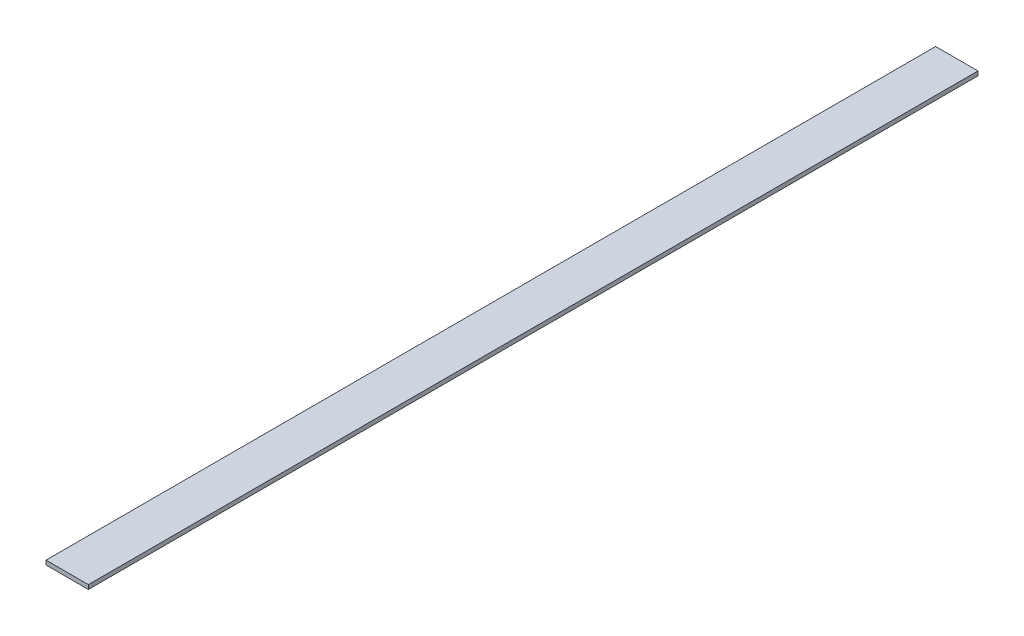
ISO-10303-21;
HEADER;
FILE_DESCRIPTION(('STEP AP214'),'2;1');
FILE_NAME('part.step','',(''),(''),'','','');
FILE_SCHEMA(('AUTOMOTIVE_DESIGN { 1 0 10303 214 1 1 1 1 }'));
ENDSEC;
DATA;
#1=APPLICATION_CONTEXT('core data for automotive mechanical design processes');
#2=APPLICATION_PROTOCOL_DEFINITION('international standard','automotive_design',2000,#1);
#3=PRODUCT_CONTEXT('',#1,'mechanical');
#4=PRODUCT('Part','Part','',(#3));
#5=PRODUCT_RELATED_PRODUCT_CATEGORY('part','',(#4));
#6=PRODUCT_DEFINITION_FORMATION('','',#4);
#7=PRODUCT_DEFINITION_CONTEXT('part definition',#1,'design');
#8=PRODUCT_DEFINITION('design','',#6,#7);
#9=PRODUCT_DEFINITION_SHAPE('','',#8);
#10=(LENGTH_UNIT() NAMED_UNIT(*) SI_UNIT(.MILLI.,.METRE.));
#11=(NAMED_UNIT(*) PLANE_ANGLE_UNIT() SI_UNIT($,.RADIAN.));
#12=(NAMED_UNIT(*) SI_UNIT($,.STERADIAN.) SOLID_ANGLE_UNIT());
#13=UNCERTAINTY_MEASURE_WITH_UNIT(LENGTH_MEASURE(1.E-05),#10,'distance_accuracy_value','');
#14=(GEOMETRIC_REPRESENTATION_CONTEXT(3) GLOBAL_UNCERTAINTY_ASSIGNED_CONTEXT((#13)) GLOBAL_UNIT_ASSIGNED_CONTEXT((#10,
#11,#12)) REPRESENTATION_CONTEXT('',''));
#15=CARTESIAN_POINT('',(0.,0.,0.));
#16=DIRECTION('',(0.,0.,1.));
#17=DIRECTION('',(1.,0.,0.));
#18=AXIS2_PLACEMENT_3D('',#15,#16,#17);
#19=CARTESIAN_POINT('',(-50.7999999999998,5.08,0.));
#20=DIRECTION('',(0.,0.,-1.));
#21=DIRECTION('',(-1.,0.,0.));
#22=AXIS2_PLACEMENT_3D('',#19,#20,#21);
#23=PLANE('',#22);
#24=DIRECTION('',(1.,0.,0.));
#25=VECTOR('',#24,1.);
#26=CARTESIAN_POINT('',(-50.7999999999998,0.,0.));
#27=LINE('',#26,#25);
#28=CARTESIAN_POINT('',(-50.7999999999998,0.,0.));
#29=VERTEX_POINT('',#28);
#30=CARTESIAN_POINT('',(0.,0.,0.));
#31=VERTEX_POINT('',#30);
#32=EDGE_CURVE('E115',#29,#31,#27,.T.);
#33=ORIENTED_EDGE('',*,*,#32,.T.);
#34=DIRECTION('',(0.,-1.,0.));
#35=VECTOR('',#34,1.);
#36=CARTESIAN_POINT('',(0.,5.08,0.));
#37=LINE('',#36,#35);
#38=CARTESIAN_POINT('',(0.,5.08,0.));
#39=VERTEX_POINT('',#38);
#40=EDGE_CURVE('E11',#39,#31,#37,.T.);
#41=ORIENTED_EDGE('',*,*,#40,.F.);
#42=DIRECTION('',(1.,0.,0.));
#43=VECTOR('',#42,1.);
#44=CARTESIAN_POINT('',(-50.7999999999998,5.08,0.));
#45=LINE('',#44,#43);
#46=CARTESIAN_POINT('',(-50.7999999999998,5.08,0.));
#47=VERTEX_POINT('',#46);
#48=EDGE_CURVE('E97',#47,#39,#45,.T.);
#49=ORIENTED_EDGE('',*,*,#48,.F.);
#50=DIRECTION('',(0.,-1.,0.));
#51=VECTOR('',#50,1.);
#52=CARTESIAN_POINT('',(-50.7999999999998,5.08,0.));
#53=LINE('',#52,#51);
#54=EDGE_CURVE('E111',#47,#29,#53,.T.);
#55=ORIENTED_EDGE('',*,*,#54,.T.);
#56=EDGE_LOOP('',(#33,#41,#49,#55));
#57=FACE_BOUND('',#56,.T.);
#58=ADVANCED_FACE('F45',(#57),#23,.F.);
#59=CARTESIAN_POINT('',(0.,5.08,0.));
#60=DIRECTION('',(-1.,0.,0.));
#61=DIRECTION('',(0.,0.,1.));
#62=AXIS2_PLACEMENT_3D('',#59,#60,#61);
#63=PLANE('',#62);
#64=DIRECTION('',(0.,0.,-1.));
#65=VECTOR('',#64,1.);
#66=CARTESIAN_POINT('',(0.,0.,0.));
#67=LINE('',#66,#65);
#68=CARTESIAN_POINT('',(0.,0.,-1066.8));
#69=VERTEX_POINT('',#68);
#70=EDGE_CURVE('E102',#31,#69,#67,.T.);
#71=ORIENTED_EDGE('',*,*,#70,.T.);
#72=DIRECTION('',(0.,-1.,0.));
#73=VECTOR('',#72,1.);
#74=CARTESIAN_POINT('',(0.,5.08,-1066.8));
#75=LINE('',#74,#73);
#76=CARTESIAN_POINT('',(0.,5.08,-1066.8));
#77=VERTEX_POINT('',#76);
#78=EDGE_CURVE('E54',#77,#69,#75,.T.);
#79=ORIENTED_EDGE('',*,*,#78,.F.);
#80=DIRECTION('',(0.,0.,-1.));
#81=VECTOR('',#80,1.);
#82=CARTESIAN_POINT('',(0.,5.08,0.));
#83=LINE('',#82,#81);
#84=EDGE_CURVE('E92',#39,#77,#83,.T.);
#85=ORIENTED_EDGE('',*,*,#84,.F.);
#86=ORIENTED_EDGE('',*,*,#40,.T.);
#87=EDGE_LOOP('',(#71,#79,#85,#86));
#88=FACE_BOUND('',#87,.T.);
#89=ADVANCED_FACE('F101',(#88),#63,.F.);
#90=CARTESIAN_POINT('',(0.,5.08,-1066.8));
#91=DIRECTION('',(0.,0.,1.));
#92=DIRECTION('',(1.,0.,0.));
#93=AXIS2_PLACEMENT_3D('',#90,#91,#92);
#94=PLANE('',#93);
#95=DIRECTION('',(-1.,0.,0.));
#96=VECTOR('',#95,1.);
#97=CARTESIAN_POINT('',(0.,0.,-1066.8));
#98=LINE('',#97,#96);
#99=CARTESIAN_POINT('',(-50.7999999999999,0.,-1066.8));
#100=VERTEX_POINT('',#99);
#101=EDGE_CURVE('E79',#69,#100,#98,.T.);
#102=ORIENTED_EDGE('',*,*,#101,.T.);
#103=DIRECTION('',(0.,-1.,0.));
#104=VECTOR('',#103,1.);
#105=CARTESIAN_POINT('',(-50.7999999999999,5.08,-1066.8));
#106=LINE('',#105,#104);
#107=CARTESIAN_POINT('',(-50.7999999999999,5.08,-1066.8));
#108=VERTEX_POINT('',#107);
#109=EDGE_CURVE('E104',#108,#100,#106,.T.);
#110=ORIENTED_EDGE('',*,*,#109,.F.);
#111=DIRECTION('',(-1.,0.,0.));
#112=VECTOR('',#111,1.);
#113=CARTESIAN_POINT('',(0.,5.08,-1066.8));
#114=LINE('',#113,#112);
#115=EDGE_CURVE('E95',#77,#108,#114,.T.);
#116=ORIENTED_EDGE('',*,*,#115,.F.);
#117=ORIENTED_EDGE('',*,*,#78,.T.);
#118=EDGE_LOOP('',(#102,#110,#116,#117));
#119=FACE_BOUND('',#118,.T.);
#120=ADVANCED_FACE('F105',(#119),#94,.F.);
#121=CARTESIAN_POINT('',(-50.7999999999999,5.08,-1066.8));
#122=DIRECTION('',(1.,0.,0.));
#123=DIRECTION('',(0.,0.,-1.));
#124=AXIS2_PLACEMENT_3D('',#121,#122,#123);
#125=PLANE('',#124);
#126=DIRECTION('',(0.,0.,1.));
#127=VECTOR('',#126,1.);
#128=CARTESIAN_POINT('',(-50.7999999999999,0.,-1066.8));
#129=LINE('',#128,#127);
#130=EDGE_CURVE('E85',#100,#29,#129,.T.);
#131=ORIENTED_EDGE('',*,*,#130,.T.);
#132=ORIENTED_EDGE('',*,*,#54,.F.);
#133=DIRECTION('',(0.,0.,1.));
#134=VECTOR('',#133,1.);
#135=CARTESIAN_POINT('',(-50.7999999999999,5.08,-1066.8));
#136=LINE('',#135,#134);
#137=EDGE_CURVE('E62',#108,#47,#136,.T.);
#138=ORIENTED_EDGE('',*,*,#137,.F.);
#139=ORIENTED_EDGE('',*,*,#109,.T.);
#140=EDGE_LOOP('',(#131,#132,#138,#139));
#141=FACE_BOUND('',#140,.T.);
#142=ADVANCED_FACE('F127',(#141),#125,.F.);
#143=CARTESIAN_POINT('',(0.,5.08,0.));
#144=DIRECTION('',(0.,1.,0.));
#145=DIRECTION('',(0.,0.,1.));
#146=AXIS2_PLACEMENT_3D('',#143,#144,#145);
#147=PLANE('',#146);
#148=ORIENTED_EDGE('',*,*,#48,.T.);
#149=ORIENTED_EDGE('',*,*,#84,.T.);
#150=ORIENTED_EDGE('',*,*,#115,.T.);
#151=ORIENTED_EDGE('',*,*,#137,.T.);
#152=EDGE_LOOP('',(#148,#149,#150,#151));
#153=FACE_BOUND('',#152,.T.);
#154=ADVANCED_FACE('F93',(#153),#147,.T.);
#155=CARTESIAN_POINT('',(0.,0.,0.));
#156=DIRECTION('',(0.,1.,0.));
#157=DIRECTION('',(0.,0.,1.));
#158=AXIS2_PLACEMENT_3D('',#155,#156,#157);
#159=PLANE('',#158);
#160=ORIENTED_EDGE('',*,*,#32,.F.);
#161=ORIENTED_EDGE('',*,*,#130,.F.);
#162=ORIENTED_EDGE('',*,*,#101,.F.);
#163=ORIENTED_EDGE('',*,*,#70,.F.);
#164=EDGE_LOOP('',(#160,#161,#162,#163));
#165=FACE_BOUND('',#164,.T.);
#166=ADVANCED_FACE('F130',(#165),#159,.F.);
#167=CLOSED_SHELL('',(#58,#89,#120,#142,#154,#166));
#168=MANIFOLD_SOLID_BREP('B2',#167);
#169=ADVANCED_BREP_SHAPE_REPRESENTATION('',(#18,#168),#14);
#170=SHAPE_DEFINITION_REPRESENTATION(#9,#169);
ENDSEC;
END-ISO-10303-21;
